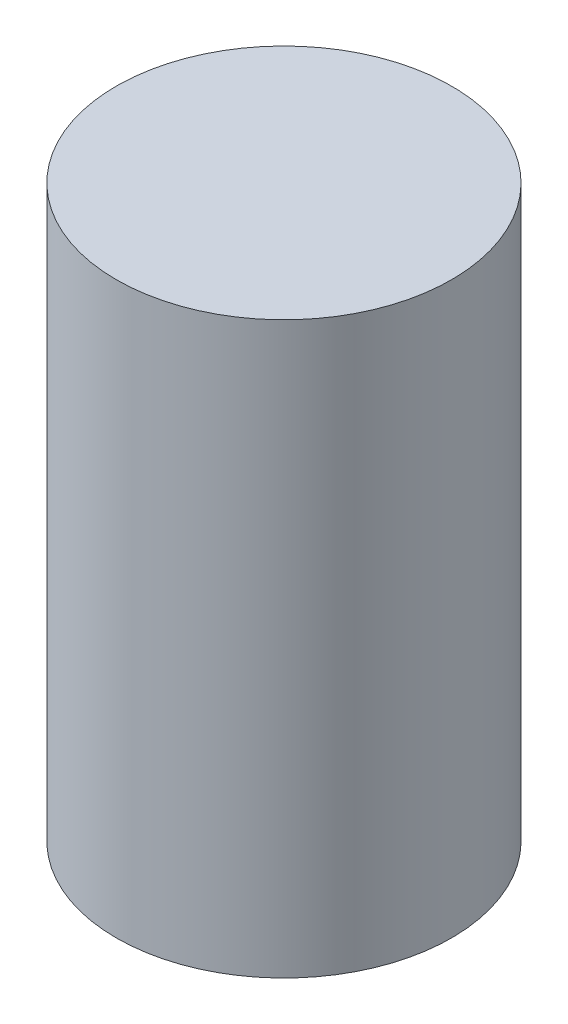
ISO-10303-21;
HEADER;
FILE_DESCRIPTION(('STEP AP214'),'2;1');
FILE_NAME('part.step','',(''),(''),'','','');
FILE_SCHEMA(('AUTOMOTIVE_DESIGN { 1 0 10303 214 1 1 1 1 }'));
ENDSEC;
DATA;
#1=APPLICATION_CONTEXT('core data for automotive mechanical design processes');
#2=APPLICATION_PROTOCOL_DEFINITION('international standard','automotive_design',2000,#1);
#3=PRODUCT_CONTEXT('',#1,'mechanical');
#4=PRODUCT('Part','Part','',(#3));
#5=PRODUCT_RELATED_PRODUCT_CATEGORY('part','',(#4));
#6=PRODUCT_DEFINITION_FORMATION('','',#4);
#7=PRODUCT_DEFINITION_CONTEXT('part definition',#1,'design');
#8=PRODUCT_DEFINITION('design','',#6,#7);
#9=PRODUCT_DEFINITION_SHAPE('','',#8);
#10=(LENGTH_UNIT() NAMED_UNIT(*) SI_UNIT(.MILLI.,.METRE.));
#11=(NAMED_UNIT(*) PLANE_ANGLE_UNIT() SI_UNIT($,.RADIAN.));
#12=(NAMED_UNIT(*) SI_UNIT($,.STERADIAN.) SOLID_ANGLE_UNIT());
#13=UNCERTAINTY_MEASURE_WITH_UNIT(LENGTH_MEASURE(1.E-05),#10,'distance_accuracy_value','');
#14=(GEOMETRIC_REPRESENTATION_CONTEXT(3) GLOBAL_UNCERTAINTY_ASSIGNED_CONTEXT((#13)) GLOBAL_UNIT_ASSIGNED_CONTEXT((#10,
#11,#12)) REPRESENTATION_CONTEXT('',''));
#15=CARTESIAN_POINT('',(0.,0.,0.));
#16=DIRECTION('',(0.,0.,1.));
#17=DIRECTION('',(1.,0.,0.));
#18=AXIS2_PLACEMENT_3D('',#15,#16,#17);
#19=CARTESIAN_POINT('',(0.,6.8,0.));
#20=DIRECTION('',(0.,-1.,0.));
#21=DIRECTION('',(0.,0.,-1.));
#22=AXIS2_PLACEMENT_3D('',#19,#20,#21);
#23=CYLINDRICAL_SURFACE('',#22,2.);
#24=CARTESIAN_POINT('',(0.,6.8,0.));
#25=DIRECTION('',(0.,1.,0.));
#26=DIRECTION('',(0.,0.,1.));
#27=AXIS2_PLACEMENT_3D('',#24,#25,#26);
#28=CIRCLE('',#27,2.);
#29=CARTESIAN_POINT('',(0.,6.8,2.));
#30=VERTEX_POINT('',#29);
#31=EDGE_CURVE('E10',#30,#30,#28,.T.);
#32=ORIENTED_EDGE('',*,*,#31,.F.);
#33=EDGE_LOOP('',(#32));
#34=FACE_BOUND('',#33,.T.);
#35=CARTESIAN_POINT('',(0.,0.,0.));
#36=DIRECTION('',(0.,1.,0.));
#37=DIRECTION('',(0.,0.,1.));
#38=AXIS2_PLACEMENT_3D('',#35,#36,#37);
#39=CIRCLE('',#38,2.);
#40=CARTESIAN_POINT('',(0.,0.,2.));
#41=VERTEX_POINT('',#40);
#42=EDGE_CURVE('E37',#41,#41,#39,.T.);
#43=ORIENTED_EDGE('',*,*,#42,.T.);
#44=EDGE_LOOP('',(#43));
#45=FACE_BOUND('',#44,.T.);
#46=ADVANCED_FACE('F34',(#34,#45),#23,.T.);
#47=CARTESIAN_POINT('',(0.,6.8,0.));
#48=DIRECTION('',(0.,1.,0.));
#49=DIRECTION('',(0.,0.,1.));
#50=AXIS2_PLACEMENT_3D('',#47,#48,#49);
#51=PLANE('',#50);
#52=ORIENTED_EDGE('',*,*,#31,.T.);
#53=EDGE_LOOP('',(#52));
#54=FACE_BOUND('',#53,.T.);
#55=ADVANCED_FACE('F49',(#54),#51,.T.);
#56=CARTESIAN_POINT('',(0.,0.,0.));
#57=DIRECTION('',(0.,1.,0.));
#58=DIRECTION('',(0.,0.,1.));
#59=AXIS2_PLACEMENT_3D('',#56,#57,#58);
#60=PLANE('',#59);
#61=ORIENTED_EDGE('',*,*,#42,.F.);
#62=EDGE_LOOP('',(#61));
#63=FACE_BOUND('',#62,.T.);
#64=ADVANCED_FACE('F47',(#63),#60,.F.);
#65=CLOSED_SHELL('',(#46,#55,#64));
#66=MANIFOLD_SOLID_BREP('B2',#65);
#67=ADVANCED_BREP_SHAPE_REPRESENTATION('',(#18,#66),#14);
#68=SHAPE_DEFINITION_REPRESENTATION(#9,#67);
ENDSEC;
END-ISO-10303-21;
